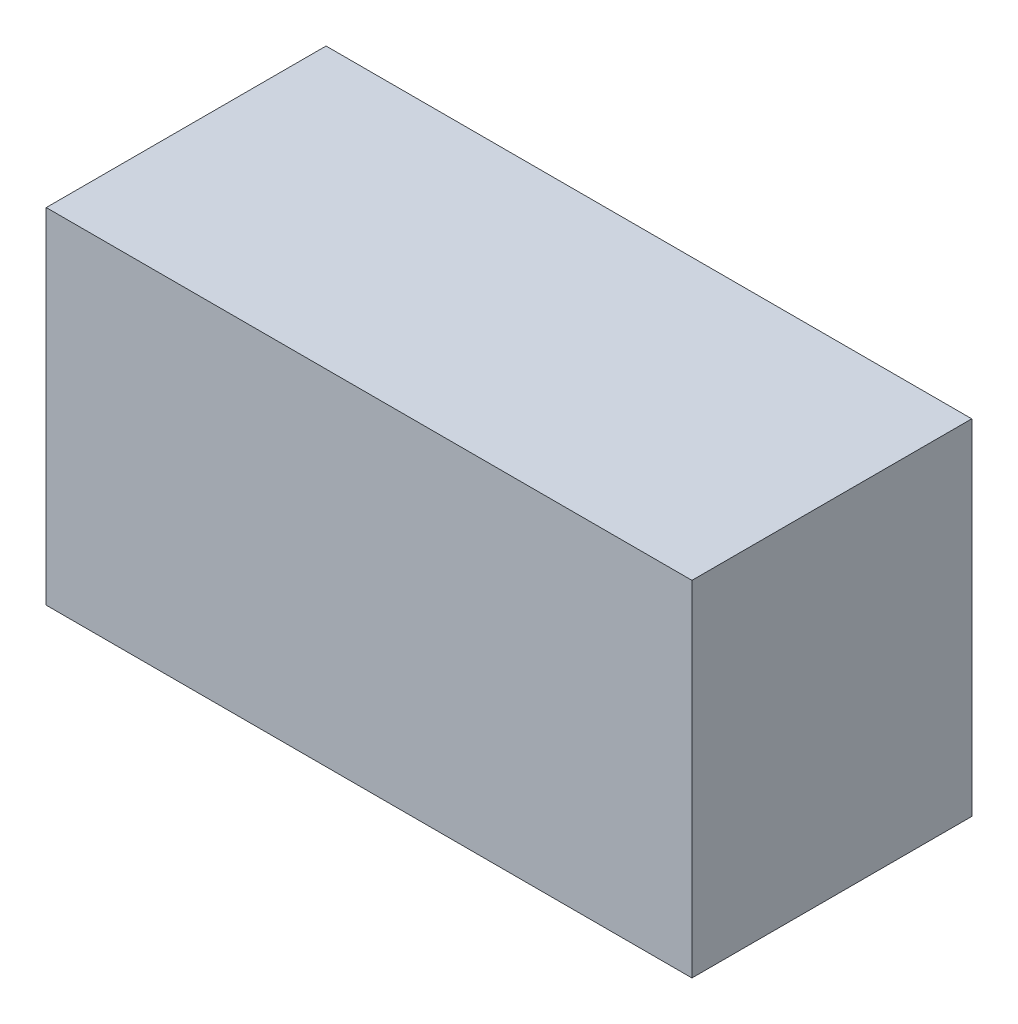
ISO-10303-21;
HEADER;
FILE_DESCRIPTION(('STEP AP214'),'2;1');
FILE_NAME('part.step','',(''),(''),'','','');
FILE_SCHEMA(('AUTOMOTIVE_DESIGN { 1 0 10303 214 1 1 1 1 }'));
ENDSEC;
DATA;
#1=APPLICATION_CONTEXT('core data for automotive mechanical design processes');
#2=APPLICATION_PROTOCOL_DEFINITION('international standard','automotive_design',2000,#1);
#3=PRODUCT_CONTEXT('',#1,'mechanical');
#4=PRODUCT('Part','Part','',(#3));
#5=PRODUCT_RELATED_PRODUCT_CATEGORY('part','',(#4));
#6=PRODUCT_DEFINITION_FORMATION('','',#4);
#7=PRODUCT_DEFINITION_CONTEXT('part definition',#1,'design');
#8=PRODUCT_DEFINITION('design','',#6,#7);
#9=PRODUCT_DEFINITION_SHAPE('','',#8);
#10=(LENGTH_UNIT() NAMED_UNIT(*) SI_UNIT(.MILLI.,.METRE.));
#11=(NAMED_UNIT(*) PLANE_ANGLE_UNIT() SI_UNIT($,.RADIAN.));
#12=(NAMED_UNIT(*) SI_UNIT($,.STERADIAN.) SOLID_ANGLE_UNIT());
#13=UNCERTAINTY_MEASURE_WITH_UNIT(LENGTH_MEASURE(1.E-05),#10,'distance_accuracy_value','');
#14=(GEOMETRIC_REPRESENTATION_CONTEXT(3) GLOBAL_UNCERTAINTY_ASSIGNED_CONTEXT((#13)) GLOBAL_UNIT_ASSIGNED_CONTEXT((#10,
#11,#12)) REPRESENTATION_CONTEXT('',''));
#15=CARTESIAN_POINT('',(0.,0.,0.));
#16=DIRECTION('',(0.,0.,1.));
#17=DIRECTION('',(1.,0.,0.));
#18=AXIS2_PLACEMENT_3D('',#15,#16,#17);
#19=CARTESIAN_POINT('',(30.,-16.,26.));
#20=DIRECTION('',(-1.,0.,0.));
#21=DIRECTION('',(0.,0.,1.));
#22=AXIS2_PLACEMENT_3D('',#19,#20,#21);
#23=PLANE('',#22);
#24=DIRECTION('',(0.,1.,0.));
#25=VECTOR('',#24,1.);
#26=CARTESIAN_POINT('',(30.,-16.,0.));
#27=LINE('',#26,#25);
#28=CARTESIAN_POINT('',(30.,-16.,0.));
#29=VERTEX_POINT('',#28);
#30=CARTESIAN_POINT('',(30.,16.,0.));
#31=VERTEX_POINT('',#30);
#32=EDGE_CURVE('E102',#29,#31,#27,.T.);
#33=ORIENTED_EDGE('',*,*,#32,.T.);
#34=DIRECTION('',(0.,0.,-1.));
#35=VECTOR('',#34,1.);
#36=CARTESIAN_POINT('',(30.,16.,26.));
#37=LINE('',#36,#35);
#38=CARTESIAN_POINT('',(30.,16.,26.));
#39=VERTEX_POINT('',#38);
#40=EDGE_CURVE('E11',#39,#31,#37,.T.);
#41=ORIENTED_EDGE('',*,*,#40,.F.);
#42=DIRECTION('',(0.,1.,0.));
#43=VECTOR('',#42,1.);
#44=CARTESIAN_POINT('',(30.,-16.,26.));
#45=LINE('',#44,#43);
#46=CARTESIAN_POINT('',(30.,-16.,26.));
#47=VERTEX_POINT('',#46);
#48=EDGE_CURVE('E95',#47,#39,#45,.T.);
#49=ORIENTED_EDGE('',*,*,#48,.F.);
#50=DIRECTION('',(0.,0.,-1.));
#51=VECTOR('',#50,1.);
#52=CARTESIAN_POINT('',(30.,-16.,26.));
#53=LINE('',#52,#51);
#54=EDGE_CURVE('E99',#47,#29,#53,.T.);
#55=ORIENTED_EDGE('',*,*,#54,.T.);
#56=EDGE_LOOP('',(#33,#41,#49,#55));
#57=FACE_BOUND('',#56,.T.);
#58=ADVANCED_FACE('F41',(#57),#23,.F.);
#59=CARTESIAN_POINT('',(-30.,16.,26.));
#60=DIRECTION('',(0.,-1.,0.));
#61=DIRECTION('',(0.,0.,-1.));
#62=AXIS2_PLACEMENT_3D('',#59,#60,#61);
#63=PLANE('',#62);
#64=DIRECTION('',(-1.,0.,0.));
#65=VECTOR('',#64,1.);
#66=CARTESIAN_POINT('',(-30.,16.,0.));
#67=LINE('',#66,#65);
#68=CARTESIAN_POINT('',(-30.,16.,0.));
#69=VERTEX_POINT('',#68);
#70=EDGE_CURVE('E96',#31,#69,#67,.T.);
#71=ORIENTED_EDGE('',*,*,#70,.T.);
#72=DIRECTION('',(0.,0.,-1.));
#73=VECTOR('',#72,1.);
#74=CARTESIAN_POINT('',(-30.,16.,26.));
#75=LINE('',#74,#73);
#76=CARTESIAN_POINT('',(-30.,16.,26.));
#77=VERTEX_POINT('',#76);
#78=EDGE_CURVE('E47',#77,#69,#75,.T.);
#79=ORIENTED_EDGE('',*,*,#78,.F.);
#80=DIRECTION('',(-1.,0.,0.));
#81=VECTOR('',#80,1.);
#82=CARTESIAN_POINT('',(-30.,16.,26.));
#83=LINE('',#82,#81);
#84=EDGE_CURVE('E87',#39,#77,#83,.T.);
#85=ORIENTED_EDGE('',*,*,#84,.F.);
#86=ORIENTED_EDGE('',*,*,#40,.T.);
#87=EDGE_LOOP('',(#71,#79,#85,#86));
#88=FACE_BOUND('',#87,.T.);
#89=ADVANCED_FACE('F92',(#88),#63,.F.);
#90=CARTESIAN_POINT('',(-30.,-16.,26.));
#91=DIRECTION('',(1.,0.,0.));
#92=DIRECTION('',(0.,0.,-1.));
#93=AXIS2_PLACEMENT_3D('',#90,#91,#92);
#94=PLANE('',#93);
#95=DIRECTION('',(0.,-1.,0.));
#96=VECTOR('',#95,1.);
#97=CARTESIAN_POINT('',(-30.,-16.,0.));
#98=LINE('',#97,#96);
#99=CARTESIAN_POINT('',(-30.,-16.,0.));
#100=VERTEX_POINT('',#99);
#101=EDGE_CURVE('E74',#69,#100,#98,.T.);
#102=ORIENTED_EDGE('',*,*,#101,.T.);
#103=DIRECTION('',(0.,0.,-1.));
#104=VECTOR('',#103,1.);
#105=CARTESIAN_POINT('',(-30.,-16.,26.));
#106=LINE('',#105,#104);
#107=CARTESIAN_POINT('',(-30.,-16.,26.));
#108=VERTEX_POINT('',#107);
#109=EDGE_CURVE('E100',#108,#100,#106,.T.);
#110=ORIENTED_EDGE('',*,*,#109,.F.);
#111=DIRECTION('',(0.,-1.,0.));
#112=VECTOR('',#111,1.);
#113=CARTESIAN_POINT('',(-30.,-16.,26.));
#114=LINE('',#113,#112);
#115=EDGE_CURVE('E89',#77,#108,#114,.T.);
#116=ORIENTED_EDGE('',*,*,#115,.F.);
#117=ORIENTED_EDGE('',*,*,#78,.T.);
#118=EDGE_LOOP('',(#102,#110,#116,#117));
#119=FACE_BOUND('',#118,.T.);
#120=ADVANCED_FACE('F98',(#119),#94,.F.);
#121=CARTESIAN_POINT('',(-30.,-16.,26.));
#122=DIRECTION('',(0.,1.,0.));
#123=DIRECTION('',(0.,0.,1.));
#124=AXIS2_PLACEMENT_3D('',#121,#122,#123);
#125=PLANE('',#124);
#126=DIRECTION('',(1.,0.,0.));
#127=VECTOR('',#126,1.);
#128=CARTESIAN_POINT('',(-30.,-16.,0.));
#129=LINE('',#128,#127);
#130=EDGE_CURVE('E79',#100,#29,#129,.T.);
#131=ORIENTED_EDGE('',*,*,#130,.T.);
#132=ORIENTED_EDGE('',*,*,#54,.F.);
#133=DIRECTION('',(1.,0.,0.));
#134=VECTOR('',#133,1.);
#135=CARTESIAN_POINT('',(-30.,-16.,26.));
#136=LINE('',#135,#134);
#137=EDGE_CURVE('E60',#108,#47,#136,.T.);
#138=ORIENTED_EDGE('',*,*,#137,.F.);
#139=ORIENTED_EDGE('',*,*,#109,.T.);
#140=EDGE_LOOP('',(#131,#132,#138,#139));
#141=FACE_BOUND('',#140,.T.);
#142=ADVANCED_FACE('F112',(#141),#125,.F.);
#143=CARTESIAN_POINT('',(0.,0.,26.));
#144=DIRECTION('',(0.,0.,-1.));
#145=DIRECTION('',(-1.,0.,0.));
#146=AXIS2_PLACEMENT_3D('',#143,#144,#145);
#147=PLANE('',#146);
#148=ORIENTED_EDGE('',*,*,#48,.T.);
#149=ORIENTED_EDGE('',*,*,#84,.T.);
#150=ORIENTED_EDGE('',*,*,#115,.T.);
#151=ORIENTED_EDGE('',*,*,#137,.T.);
#152=EDGE_LOOP('',(#148,#149,#150,#151));
#153=FACE_BOUND('',#152,.T.);
#154=ADVANCED_FACE('F86',(#153),#147,.F.);
#155=CARTESIAN_POINT('',(0.,0.,0.));
#156=DIRECTION('',(0.,0.,-1.));
#157=DIRECTION('',(-1.,0.,0.));
#158=AXIS2_PLACEMENT_3D('',#155,#156,#157);
#159=PLANE('',#158);
#160=ORIENTED_EDGE('',*,*,#32,.F.);
#161=ORIENTED_EDGE('',*,*,#130,.F.);
#162=ORIENTED_EDGE('',*,*,#101,.F.);
#163=ORIENTED_EDGE('',*,*,#70,.F.);
#164=EDGE_LOOP('',(#160,#161,#162,#163));
#165=FACE_BOUND('',#164,.T.);
#166=ADVANCED_FACE('F111',(#165),#159,.T.);
#167=CLOSED_SHELL('',(#58,#89,#120,#142,#154,#166));
#168=MANIFOLD_SOLID_BREP('B2',#167);
#169=ADVANCED_BREP_SHAPE_REPRESENTATION('',(#18,#168),#14);
#170=SHAPE_DEFINITION_REPRESENTATION(#9,#169);
ENDSEC;
END-ISO-10303-21;
